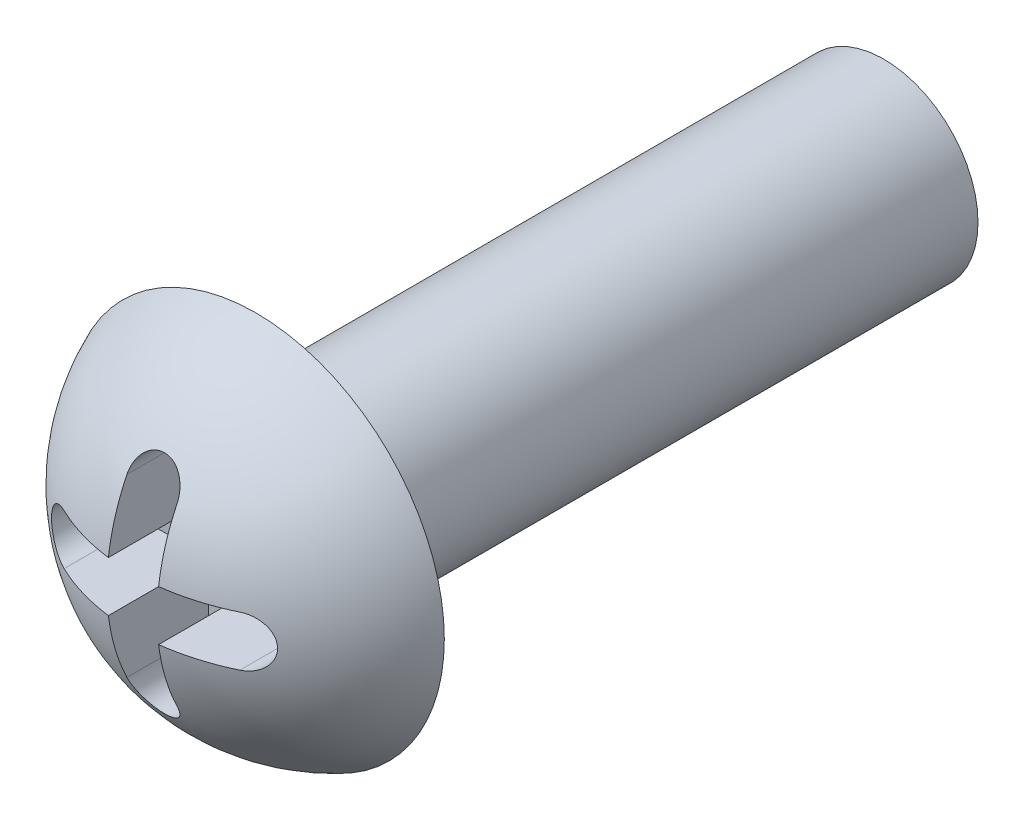
ISO-10303-21;
HEADER;
FILE_DESCRIPTION(('STEP AP214'),'2;1');
FILE_NAME('part.step','',(''),(''),'','','');
FILE_SCHEMA(('AUTOMOTIVE_DESIGN { 1 0 10303 214 1 1 1 1 }'));
ENDSEC;
DATA;
#1=APPLICATION_CONTEXT('core data for automotive mechanical design processes');
#2=APPLICATION_PROTOCOL_DEFINITION('international standard','automotive_design',2000,#1);
#3=PRODUCT_CONTEXT('',#1,'mechanical');
#4=PRODUCT('Part','Part','',(#3));
#5=PRODUCT_RELATED_PRODUCT_CATEGORY('part','',(#4));
#6=PRODUCT_DEFINITION_FORMATION('','',#4);
#7=PRODUCT_DEFINITION_CONTEXT('part definition',#1,'design');
#8=PRODUCT_DEFINITION('design','',#6,#7);
#9=PRODUCT_DEFINITION_SHAPE('','',#8);
#10=(LENGTH_UNIT() NAMED_UNIT(*) SI_UNIT(.MILLI.,.METRE.));
#11=(NAMED_UNIT(*) PLANE_ANGLE_UNIT() SI_UNIT($,.RADIAN.));
#12=(NAMED_UNIT(*) SI_UNIT($,.STERADIAN.) SOLID_ANGLE_UNIT());
#13=UNCERTAINTY_MEASURE_WITH_UNIT(LENGTH_MEASURE(1.E-05),#10,'distance_accuracy_value','');
#14=(GEOMETRIC_REPRESENTATION_CONTEXT(3) GLOBAL_UNCERTAINTY_ASSIGNED_CONTEXT((#13)) GLOBAL_UNIT_ASSIGNED_CONTEXT((#10,
#11,#12)) REPRESENTATION_CONTEXT('',''));
#15=CARTESIAN_POINT('',(0.,0.,0.));
#16=DIRECTION('',(0.,0.,1.));
#17=DIRECTION('',(1.,0.,0.));
#18=AXIS2_PLACEMENT_3D('',#15,#16,#17);
#19=CARTESIAN_POINT('',(-27.6153768,0.,29.6958848));
#20=DIRECTION('',(0.,0.,1.));
#21=DIRECTION('',(-1.,0.,0.));
#22=AXIS2_PLACEMENT_3D('',#19,#20,#21);
#23=SPHERICAL_SURFACE('',#22,1.62500000000001);
#24=CARTESIAN_POINT('',(-27.6153768,0.2,29.6958848));
#25=DIRECTION('',(0.,1.,0.));
#26=DIRECTION('',(-1.,0.,0.));
#27=AXIS2_PLACEMENT_3D('',#24,#25,#26);
#28=CIRCLE('',#27,1.61264534228702);
#29=CARTESIAN_POINT('',(-28.3153768,0.199999999999967,31.1486838225768));
#30=VERTEX_POINT('',#29);
#31=CARTESIAN_POINT('',(-27.8153768,0.2,31.2960801005805));
#32=VERTEX_POINT('',#31);
#33=EDGE_CURVE('E136',#30,#32,#28,.T.);
#34=ORIENTED_EDGE('',*,*,#33,.T.);
#35=CARTESIAN_POINT('',(-27.8153768,0.,29.6958848));
#36=DIRECTION('',(-1.,0.,0.));
#37=DIRECTION('',(0.,0.,1.));
#38=AXIS2_PLACEMENT_3D('',#35,#36,#37);
#39=CIRCLE('',#38,1.61264534228702);
#40=CARTESIAN_POINT('',(-27.8153768,0.7,31.1486838225767));
#41=VERTEX_POINT('',#40);
#42=EDGE_CURVE('E175',#32,#41,#39,.T.);
#43=ORIENTED_EDGE('',*,*,#42,.T.);
#44=CARTESIAN_POINT('',(-27.8153767,0.699800000000001,31.1487801850845));
#45=CARTESIAN_POINT('',(-27.8153926425318,0.712114662218609,31.1428485283511));
#46=CARTESIAN_POINT('',(-27.8142639633516,0.724417750383114,31.1368831575603));
#47=CARTESIAN_POINT('',(-27.8097522195165,0.748688611010362,31.1250436135103));
#48=CARTESIAN_POINT('',(-27.806363329716,0.760655433564896,31.1191697161355));
#49=CARTESIAN_POINT('',(-27.7973606277295,0.783889067953735,31.1076969539091));
#50=CARTESIAN_POINT('',(-27.7917439923433,0.795154970479538,31.1020984482172));
#51=CARTESIAN_POINT('',(-27.778369290326,0.816587812625166,31.0913885193177));
#52=CARTESIAN_POINT('',(-27.7706132779781,0.826755793529295,31.0862766351461));
#53=CARTESIAN_POINT('',(-27.7535634459189,0.84509588101439,31.077011567816));
#54=CARTESIAN_POINT('',(-27.7443729961195,0.853345237981694,31.0728219187545));
#55=CARTESIAN_POINT('',(-27.72439985314,0.868130791385543,31.065284717777));
#56=CARTESIAN_POINT('',(-27.7136182521384,0.87466815447501,31.0619365924603));
#57=CARTESIAN_POINT('',(-27.6920610441544,0.885058057308205,31.0566015514125));
#58=CARTESIAN_POINT('',(-27.6814174292111,0.889127971112714,31.0545048409988));
#59=CARTESIAN_POINT('',(-27.6594606111008,0.895414104810761,31.0512622145593));
#60=CARTESIAN_POINT('',(-27.6481479877185,0.897631905310909,31.0501154878175));
#61=CARTESIAN_POINT('',(-27.6264176010175,0.899963158034926,31.0489098871025));
#62=CARTESIAN_POINT('',(-27.6160252841277,0.900267033160122,31.0487525754142));
#63=CARTESIAN_POINT('',(-27.5953412975104,0.899262870048729,31.0492720516939));
#64=CARTESIAN_POINT('',(-27.5850496055834,0.897955195819684,31.0499486513027));
#65=CARTESIAN_POINT('',(-27.5652046500291,0.893861040700891,31.0520634730976));
#66=CARTESIAN_POINT('',(-27.5556382435269,0.891124340820223,31.0534760534797));
#67=CARTESIAN_POINT('',(-27.5371250264926,0.884320287382882,31.056979817719));
#68=CARTESIAN_POINT('',(-27.5281783054168,0.880252742191609,31.0590710993052));
#69=CARTESIAN_POINT('',(-27.5107046912532,0.870725705920803,31.0639546869098));
#70=CARTESIAN_POINT('',(-27.5022157660469,0.865211018375776,31.0667747018906));
#71=CARTESIAN_POINT('',(-27.4862835618641,0.853085804911503,31.0729521202818));
#72=CARTESIAN_POINT('',(-27.4788405881212,0.846474960329295,31.0763096799517));
#73=CARTESIAN_POINT('',(-27.4644492186524,0.831671506187274,31.0837969669014));
#74=CARTESIAN_POINT('',(-27.4576169325676,0.823387966935835,31.0879698813674));
#75=CARTESIAN_POINT('',(-27.4454288004766,0.805975400089806,31.0966983154967));
#76=CARTESIAN_POINT('',(-27.4400740942059,0.796845727038112,31.1012541269947));
#77=CARTESIAN_POINT('',(-27.4304141624481,0.776964872779153,31.1111236639975));
#78=CARTESIAN_POINT('',(-27.4262809850623,0.766144485069453,31.1164664782582));
#79=CARTESIAN_POINT('',(-27.4199494393645,0.744045930822048,31.1273141378819));
#80=CARTESIAN_POINT('',(-27.4177489464003,0.732768281274694,31.1328187984228));
#81=CARTESIAN_POINT('',(-27.4157523682811,0.714223688892898,31.1418185114114));
#82=CARTESIAN_POINT('',(-27.4153686658911,0.707012438050434,31.145305557395));
#83=CARTESIAN_POINT('',(-27.4153768999989,0.699800000000004,31.1487801850844));
#84=B_SPLINE_CURVE_WITH_KNOTS('',3,(#44,#45,#46,#47,#48,#49,#50,#51,#52,#53,#54,#55,#56,#57,#58,
#59,#60,#61,#62,#63,#64,#65,#66,#67,#68,#69,#70,#71,#72,#73,#74,#75,#76,#77,#78,#79,#80,#81,#82,
#83),.UNSPECIFIED.,.F.,.F.,(4,2,2,2,2,2,2,2,2,2,2,2,2,2,2,2,2,2,2,4),(0.,0.0409650806974917,
0.0820361490678399,0.123159433564273,0.164243367097882,0.203148468601334,0.242026988490456,
0.276592969296148,0.31112942101633,0.342167104759505,0.373197779173072,0.403213239786339,
0.433233024368789,0.464627055155396,0.496030228529066,0.530448689393814,0.564893625293371,
0.60299977091894,0.641063972804827,0.665081895194985),.UNSPECIFIED.);
#85=CARTESIAN_POINT('',(-27.4153768000428,0.700000000000034,31.1486838225826));
#86=VERTEX_POINT('',#85);
#87=EDGE_CURVE('E50',#41,#86,#84,.T.);
#88=ORIENTED_EDGE('',*,*,#87,.T.);
#89=CARTESIAN_POINT('',(-27.4153767999989,0.,29.6958848));
#90=DIRECTION('',(1.,0.,0.));
#91=DIRECTION('',(0.,0.,-1.));
#92=AXIS2_PLACEMENT_3D('',#89,#90,#91);
#93=CIRCLE('',#92,1.61264534228689);
#94=CARTESIAN_POINT('',(-27.4153768000428,0.200000000000034,31.2960801005859));
#95=VERTEX_POINT('',#94);
#96=EDGE_CURVE('E197',#86,#95,#93,.T.);
#97=ORIENTED_EDGE('',*,*,#96,.T.);
#98=CARTESIAN_POINT('',(-27.6153768,0.200000000000033,29.6958848));
#99=DIRECTION('',(0.,1.,0.));
#100=DIRECTION('',(-1.,0.,0.));
#101=AXIS2_PLACEMENT_3D('',#98,#99,#100);
#102=CIRCLE('',#101,1.61264534228702);
#103=CARTESIAN_POINT('',(-26.9153767999989,0.200000000000034,31.1486838225762));
#104=VERTEX_POINT('',#103);
#105=EDGE_CURVE('E194',#95,#104,#102,.T.);
#106=ORIENTED_EDGE('',*,*,#105,.T.);
#107=CARTESIAN_POINT('',(-26.9155768,0.199999900000008,31.1487801850845));
#108=CARTESIAN_POINT('',(-26.9032621377814,0.200015842531952,31.1428485283511));
#109=CARTESIAN_POINT('',(-26.8909590496169,0.198887163351787,31.1368831575603));
#110=CARTESIAN_POINT('',(-26.8666881889897,0.194375419516841,31.1250436135103));
#111=CARTESIAN_POINT('',(-26.8547213664352,0.190986529716319,31.1191697161355));
#112=CARTESIAN_POINT('',(-26.8314877320463,0.181983827730021,31.1076969539091));
#113=CARTESIAN_POINT('',(-26.8202218295205,0.176367192343894,31.1020984482172));
#114=CARTESIAN_POINT('',(-26.7987889873749,0.16299249032666,31.0913885193176));
#115=CARTESIAN_POINT('',(-26.7886210064707,0.155236477978836,31.0862766351461));
#116=CARTESIAN_POINT('',(-26.7702809189856,0.138186645919793,31.0770115678159));
#117=CARTESIAN_POINT('',(-26.7620315620183,0.128996196120405,31.0728219187544));
#118=CARTESIAN_POINT('',(-26.7472460086144,0.109023053141026,31.0652847177769));
#119=CARTESIAN_POINT('',(-26.7407086455249,0.0982414521394878,31.0619365924602));
#120=CARTESIAN_POINT('',(-26.7303187426916,0.0766842441555428,31.0566015514123));
#121=CARTESIAN_POINT('',(-26.726248828887,0.0660406292123068,31.0545048409986));
#122=CARTESIAN_POINT('',(-26.7199626951889,0.0440838111021101,31.0512622145591));
#123=CARTESIAN_POINT('',(-26.7177448946887,0.0327711877198093,31.0501154878173));
#124=CARTESIAN_POINT('',(-26.7154136419646,0.0110408010188264,31.0489098871022));
#125=CARTESIAN_POINT('',(-26.7151097668394,0.000648484129075412,31.0487525754139));
#126=CARTESIAN_POINT('',(-26.7161139299507,-0.0200355024882405,31.0492720516935));
#127=CARTESIAN_POINT('',(-26.7174216041797,-0.0303271944152311,31.0499486513024));
#128=CARTESIAN_POINT('',(-26.7215157592984,-0.0501721499694055,31.0520634730972));
#129=CARTESIAN_POINT('',(-26.724252459179,-0.0597385564715948,31.0534760534792));
#130=CARTESIAN_POINT('',(-26.7310565126163,-0.0782517735059256,31.0569798177185));
#131=CARTESIAN_POINT('',(-26.7351240578075,-0.0871984945817414,31.0590710993047));
#132=CARTESIAN_POINT('',(-26.7446510940782,-0.10467210874525,31.0639546869092));
#133=CARTESIAN_POINT('',(-26.7501657816232,-0.113161033951543,31.06677470189));
#134=CARTESIAN_POINT('',(-26.7622909950873,-0.129093238134362,31.0729521202812));
#135=CARTESIAN_POINT('',(-26.7689018396695,-0.136536211877271,31.0763096799511));
#136=CARTESIAN_POINT('',(-26.7837052938114,-0.150927581346032,31.0837969669007));
#137=CARTESIAN_POINT('',(-26.7919888330628,-0.15775986743085,31.0879698813668));
#138=CARTESIAN_POINT('',(-26.8094013999087,-0.169947999521873,31.096698315496));
#139=CARTESIAN_POINT('',(-26.8185310729603,-0.175302705792595,31.1012541269941));
#140=CARTESIAN_POINT('',(-26.8384119272192,-0.184962637550465,31.1111236639968));
#141=CARTESIAN_POINT('',(-26.8492323149288,-0.189095814936329,31.1164664782574));
#142=CARTESIAN_POINT('',(-26.8713308691761,-0.195427360634195,31.1273141378811));
#143=CARTESIAN_POINT('',(-26.8826085187234,-0.197627853598455,31.1328187984221));
#144=CARTESIAN_POINT('',(-26.9011531111058,-0.199624431717787,31.1418185114109));
#145=CARTESIAN_POINT('',(-26.9083643619489,-0.200008134107847,31.1453055573949));
#146=CARTESIAN_POINT('',(-26.9155768,-0.199999900000023,31.1487801850845));
#147=B_SPLINE_CURVE_WITH_KNOTS('',3,(#107,#108,#109,#110,#111,#112,#113,#114,#115,#116,#117,
#118,#119,#120,#121,#122,#123,#124,#125,#126,#127,#128,#129,#130,#131,#132,#133,#134,#135,#136,
#137,#138,#139,#140,#141,#142,#143,#144,#145,#146),.UNSPECIFIED.,.F.,.F.,(4,2,2,2,2,2,2,2,2,2,2,
2,2,2,2,2,2,2,2,4),(0.,0.0409650806974295,0.0820361490677104,0.123159433564081,
0.164243367097622,0.203148468601035,0.242026988490105,0.276592969295751,0.311129421015887,
0.342167104758999,0.373197779172499,0.403213239785672,0.433233024368028,0.464627055154519,
0.49603022852808,0.530448689392699,0.564893625292131,0.602999770917566,0.641063972803339,
0.665081895195618),.UNSPECIFIED.);
#148=CARTESIAN_POINT('',(-26.915376799999,-0.199999999999984,31.1486838225763));
#149=VERTEX_POINT('',#148);
#150=EDGE_CURVE('E191',#104,#149,#147,.T.);
#151=ORIENTED_EDGE('',*,*,#150,.T.);
#152=CARTESIAN_POINT('',(-27.6153768,-0.2,29.6958848));
#153=DIRECTION('',(0.,-1.,0.));
#154=DIRECTION('',(1.,0.,0.));
#155=AXIS2_PLACEMENT_3D('',#152,#153,#154);
#156=CIRCLE('',#155,1.61264534228702);
#157=CARTESIAN_POINT('',(-27.4153768000428,-0.2,31.2960801005859));
#158=VERTEX_POINT('',#157);
#159=EDGE_CURVE('E188',#149,#158,#156,.T.);
#160=ORIENTED_EDGE('',*,*,#159,.T.);
#161=CARTESIAN_POINT('',(-27.4153768000428,0.,29.6958848));
#162=DIRECTION('',(1.,0.,0.));
#163=DIRECTION('',(0.,1.,0.));
#164=AXIS2_PLACEMENT_3D('',#161,#162,#163);
#165=CIRCLE('',#164,1.61264534229233);
#166=CARTESIAN_POINT('',(-27.4153768000428,-0.700000000000002,31.1486838225826));
#167=VERTEX_POINT('',#166);
#168=EDGE_CURVE('E185',#158,#167,#165,.T.);
#169=ORIENTED_EDGE('',*,*,#168,.T.);
#170=CARTESIAN_POINT('',(-27.4153769000428,-0.699800000000001,31.1487801850904));
#171=CARTESIAN_POINT('',(-27.415360957511,-0.712114662218661,31.142848528357));
#172=CARTESIAN_POINT('',(-27.4164896366912,-0.724417750383203,31.1368831575661));
#173=CARTESIAN_POINT('',(-27.4210013805263,-0.748688611010488,31.125043613516));
#174=CARTESIAN_POINT('',(-27.4243902703269,-0.760655433565023,31.1191697161412));
#175=CARTESIAN_POINT('',(-27.4333929723134,-0.78388906795383,31.1076969539146));
#176=CARTESIAN_POINT('',(-27.4390096076996,-0.795154970479601,31.1020984482225));
#177=CARTESIAN_POINT('',(-27.452384309717,-0.816587812625151,31.0913885193227));
#178=CARTESIAN_POINT('',(-27.4601403220649,-0.826755793529233,31.086276635151));
#179=CARTESIAN_POINT('',(-27.4771901541241,-0.84509588101432,31.0770115678203));
#180=CARTESIAN_POINT('',(-27.4863806039236,-0.85334523798165,31.0728219187586));
#181=CARTESIAN_POINT('',(-27.5063537469033,-0.868130791385518,31.0652847177805));
#182=CARTESIAN_POINT('',(-27.5171353479049,-0.874668154474979,31.0619365924635));
#183=CARTESIAN_POINT('',(-27.5386925558892,-0.885058057308153,31.056601551415));
#184=CARTESIAN_POINT('',(-27.5493361708326,-0.889127971112644,31.054504841001));
#185=CARTESIAN_POINT('',(-27.5712929889432,-0.895414104810603,31.0512622145609));
#186=CARTESIAN_POINT('',(-27.5826056123258,-0.89763190531068,31.0501154878188));
#187=CARTESIAN_POINT('',(-27.6043359990271,-0.899963158034493,31.0489098871031));
#188=CARTESIAN_POINT('',(-27.6147283159169,-0.900267033159572,31.0487525754146));
#189=CARTESIAN_POINT('',(-27.6354123025345,-0.899262870047911,31.0492720516938));
#190=CARTESIAN_POINT('',(-27.6457039944616,-0.897955195818714,31.0499486513024));
#191=CARTESIAN_POINT('',(-27.6655489500158,-0.893861040699612,31.0520634730967));
#192=CARTESIAN_POINT('',(-27.675115356518,-0.891124340818807,31.0534760534786));
#193=CARTESIAN_POINT('',(-27.6936285735522,-0.884320287381194,31.0569798177175));
#194=CARTESIAN_POINT('',(-27.702575294628,-0.880252742189785,31.0590710993035));
#195=CARTESIAN_POINT('',(-27.7200489087913,-0.870725705918757,31.0639546869076));
#196=CARTESIAN_POINT('',(-27.7285378339974,-0.865211018373655,31.0667747018882));
#197=CARTESIAN_POINT('',(-27.74447003818,-0.853085804909263,31.0729521202791));
#198=CARTESIAN_POINT('',(-27.7519130119227,-0.846474960327011,31.0763096799487));
#199=CARTESIAN_POINT('',(-27.7663043813911,-0.831671506184967,31.083796966898));
#200=CARTESIAN_POINT('',(-27.7731366674757,-0.823387966933556,31.0879698813639));
#201=CARTESIAN_POINT('',(-27.7853247995663,-0.805975400087629,31.0966983154927));
#202=CARTESIAN_POINT('',(-27.7906795058369,-0.796845727036009,31.1012541269906));
#203=CARTESIAN_POINT('',(-27.8003394375943,-0.776964872777235,31.111123663993));
#204=CARTESIAN_POINT('',(-27.80447261498,-0.766144485067649,31.1164664782535));
#205=CARTESIAN_POINT('',(-27.8108041606775,-0.744045930820519,31.1273141378769));
#206=CARTESIAN_POINT('',(-27.8130046536416,-0.732768281273325,31.1328187984178));
#207=CARTESIAN_POINT('',(-27.8150012317607,-0.714223688892095,31.141818511406));
#208=CARTESIAN_POINT('',(-27.8153849341507,-0.707012438050028,31.1453055573895));
#209=CARTESIAN_POINT('',(-27.8153767000429,-0.699800000000001,31.1487801850786));
#210=B_SPLINE_CURVE_WITH_KNOTS('',3,(#170,#171,#172,#173,#174,#175,#176,#177,#178,#179,#180,
#181,#182,#183,#184,#185,#186,#187,#188,#189,#190,#191,#192,#193,#194,#195,#196,#197,#198,#199,
#200,#201,#202,#203,#204,#205,#206,#207,#208,#209),.UNSPECIFIED.,.F.,.F.,(4,2,2,2,2,2,2,2,2,2,2,
2,2,2,2,2,2,2,2,4),(0.,0.0409650806976314,0.0820361490680916,0.123159433564626,
0.164243367098351,0.20314846860229,0.242026988491879,0.276592969298154,0.311129421018915,
0.342167104762373,0.373197779176219,0.403213239789364,0.433233024371692,0.464627055157856,
0.496030228531086,0.530448689395195,0.564893625294118,0.602999770919046,0.641063972804294,
0.665081895193132),.UNSPECIFIED.);
#211=CARTESIAN_POINT('',(-27.8153768,-0.7,31.1486838225767));
#212=VERTEX_POINT('',#211);
#213=EDGE_CURVE('E182',#167,#212,#210,.T.);
#214=ORIENTED_EDGE('',*,*,#213,.T.);
#215=CARTESIAN_POINT('',(-27.8153768,0.,29.6958848));
#216=DIRECTION('',(-1.,0.,0.));
#217=DIRECTION('',(0.,0.,1.));
#218=AXIS2_PLACEMENT_3D('',#215,#216,#217);
#219=CIRCLE('',#218,1.61264534228702);
#220=CARTESIAN_POINT('',(-27.8153768,-0.2,31.2960801005805));
#221=VERTEX_POINT('',#220);
#222=EDGE_CURVE('E179',#212,#221,#219,.T.);
#223=ORIENTED_EDGE('',*,*,#222,.T.);
#224=CARTESIAN_POINT('',(-27.6153768,-0.2,29.6958848));
#225=DIRECTION('',(0.,-1.,0.));
#226=DIRECTION('',(1.,0.,0.));
#227=AXIS2_PLACEMENT_3D('',#224,#225,#226);
#228=CIRCLE('',#227,1.61264534228702);
#229=CARTESIAN_POINT('',(-28.3153768,-0.2,31.1486838225767));
#230=VERTEX_POINT('',#229);
#231=EDGE_CURVE('E133',#221,#230,#228,.T.);
#232=ORIENTED_EDGE('',*,*,#231,.T.);
#233=CARTESIAN_POINT('',(-28.3151768,-0.199999899999975,31.1487801850845));
#234=CARTESIAN_POINT('',(-28.3274914622186,-0.200015842531854,31.1428485283511));
#235=CARTESIAN_POINT('',(-28.339794550383,-0.198887163351626,31.1368831575603));
#236=CARTESIAN_POINT('',(-28.3640654110102,-0.194375419516559,31.1250436135103));
#237=CARTESIAN_POINT('',(-28.3760322335647,-0.190986529715978,31.1191697161356));
#238=CARTESIAN_POINT('',(-28.3992658679535,-0.181983827729567,31.1076969539092));
#239=CARTESIAN_POINT('',(-28.4105317704793,-0.176367192343388,31.1020984482173));
#240=CARTESIAN_POINT('',(-28.4319646126248,-0.162992490326055,31.0913885193179));
#241=CARTESIAN_POINT('',(-28.4421325935289,-0.155236477978184,31.0862766351463));
#242=CARTESIAN_POINT('',(-28.460472681014,-0.138186645919063,31.0770115678162));
#243=CARTESIAN_POINT('',(-28.4687220379813,-0.128996196119644,31.0728219187548));
#244=CARTESIAN_POINT('',(-28.4835075913851,-0.109023053140218,31.0652847177773));
#245=CARTESIAN_POINT('',(-28.4900449544745,-0.0982414521386637,31.0619365924606));
#246=CARTESIAN_POINT('',(-28.5004348573077,-0.0766842441546998,31.0566015514129));
#247=CARTESIAN_POINT('',(-28.5045047711122,-0.0660406292114596,31.0545048409991));
#248=CARTESIAN_POINT('',(-28.5107909048102,-0.0440838111012666,31.0512622145597));
#249=CARTESIAN_POINT('',(-28.5130087053103,-0.0327711877189738,31.0501154878179));
#250=CARTESIAN_POINT('',(-28.5153399580344,-0.0110408010180056,31.0489098871028));
#251=CARTESIAN_POINT('',(-28.5156438331595,-0.00064848412826003,31.0487525754146));
#252=CARTESIAN_POINT('',(-28.5146396700482,0.0200355024890375,31.0492720516943));
#253=CARTESIAN_POINT('',(-28.5133319958191,0.0303271944160151,31.0499486513031));
#254=CARTESIAN_POINT('',(-28.5092378407003,0.0501721499701689,31.052063473098));
#255=CARTESIAN_POINT('',(-28.5065011408197,0.0597385564723502,31.05347605348));
#256=CARTESIAN_POINT('',(-28.4996970873824,0.0782517735066604,31.0569798177194));
#257=CARTESIAN_POINT('',(-28.4956295421911,0.0871984945824637,31.0590710993056));
#258=CARTESIAN_POINT('',(-28.4861025059203,0.104672108745947,31.0639546869101));
#259=CARTESIAN_POINT('',(-28.4805878183753,0.113161033952227,31.0667747018909));
#260=CARTESIAN_POINT('',(-28.4684626049111,0.129093238135011,31.0729521202822));
#261=CARTESIAN_POINT('',(-28.4618517603289,0.1365362118779,31.076309679952));
#262=CARTESIAN_POINT('',(-28.4470483061869,0.150927581346614,31.0837969669017));
#263=CARTESIAN_POINT('',(-28.4387647669355,0.157759867431406,31.0879698813677));
#264=CARTESIAN_POINT('',(-28.4213522000895,0.169947999522367,31.096698315497));
#265=CARTESIAN_POINT('',(-28.4122225270378,0.175302705793056,31.101254126995));
#266=CARTESIAN_POINT('',(-28.3923416727789,0.184962637550848,31.1111236639978));
#267=CARTESIAN_POINT('',(-28.3815212850692,0.189095814936667,31.1164664782584));
#268=CARTESIAN_POINT('',(-28.3594227308219,0.195427360634436,31.1273141378821));
#269=CARTESIAN_POINT('',(-28.3481450812745,0.197627853598644,31.132818798423));
#270=CARTESIAN_POINT('',(-28.3296004888928,0.199624431717817,31.1418185114116));
#271=CARTESIAN_POINT('',(-28.3223892380504,0.200008134107843,31.1453055573952));
#272=CARTESIAN_POINT('',(-28.3151768,0.199999900000058,31.1487801850845));
#273=B_SPLINE_CURVE_WITH_KNOTS('',3,(#233,#234,#235,#236,#237,#238,#239,#240,#241,#242,#243,
#244,#245,#246,#247,#248,#249,#250,#251,#252,#253,#254,#255,#256,#257,#258,#259,#260,#261,#262,
#263,#264,#265,#266,#267,#268,#269,#270,#271,#272),.UNSPECIFIED.,.F.,.F.,(4,2,2,2,2,2,2,2,2,2,2,
2,2,2,2,2,2,2,2,4),(0.,0.0409650806973742,0.0820361490676116,0.12315943356393,0.164243367097426,
0.203148468600773,0.242026988489771,0.276592969295357,0.311129421015435,0.342167104758526,
0.373197779172006,0.403213239785194,0.433233024367568,0.464627055154097,0.496030228527692,
0.530448689392356,0.564893625291826,0.6029997709173,0.641063972803094,0.665081895193127),.UNSPECIFIED.);
#274=EDGE_CURVE('E128',#230,#30,#273,.T.);
#275=ORIENTED_EDGE('',*,*,#274,.T.);
#276=EDGE_LOOP('',(#34,#43,#88,#97,#106,#151,#160,#169,#214,#223,#232,#275));
#277=FACE_BOUND('',#276,.T.);
#278=CARTESIAN_POINT('',(-27.6153768,0.,30.3208848));
#279=DIRECTION('',(0.,0.,1.));
#280=DIRECTION('',(1.,0.,0.));
#281=AXIS2_PLACEMENT_3D('',#278,#279,#280);
#282=CIRCLE('',#281,1.5);
#283=CARTESIAN_POINT('',(-26.1153768,0.,30.3208848));
#284=VERTEX_POINT('',#283);
#285=EDGE_CURVE('E43',#284,#284,#282,.T.);
#286=ORIENTED_EDGE('',*,*,#285,.T.);
#287=EDGE_LOOP('',(#286));
#288=FACE_BOUND('',#287,.T.);
#289=ADVANCED_FACE('F36',(#277,#288),#23,.T.);
#290=CARTESIAN_POINT('',(-26.1153768,0.,30.3208848));
#291=DIRECTION('',(0.,0.,-1.));
#292=DIRECTION('',(-1.,0.,0.));
#293=AXIS2_PLACEMENT_3D('',#290,#291,#292);
#294=PLANE('',#293);
#295=CARTESIAN_POINT('',(-27.6153768,0.,30.3208848));
#296=DIRECTION('',(0.,0.,-1.));
#297=DIRECTION('',(-1.,0.,0.));
#298=AXIS2_PLACEMENT_3D('',#295,#296,#297);
#299=CIRCLE('',#298,0.750000000000001);
#300=CARTESIAN_POINT('',(-28.3653768,0.,30.3208848));
#301=VERTEX_POINT('',#300);
#302=EDGE_CURVE('E11',#301,#301,#299,.T.);
#303=ORIENTED_EDGE('',*,*,#302,.F.);
#304=EDGE_LOOP('',(#303));
#305=FACE_BOUND('',#304,.T.);
#306=ORIENTED_EDGE('',*,*,#285,.F.);
#307=EDGE_LOOP('',(#306));
#308=FACE_BOUND('',#307,.T.);
#309=ADVANCED_FACE('F269',(#305,#308),#294,.T.);
#310=CARTESIAN_POINT('',(-28.3153768,0.2,31.3218848));
#311=DIRECTION('',(0.,1.,0.));
#312=DIRECTION('',(-1.,0.,0.));
#313=AXIS2_PLACEMENT_3D('',#310,#311,#312);
#314=PLANE('',#313);
#315=ORIENTED_EDGE('',*,*,#33,.F.);
#316=DIRECTION('',(0.,0.,-1.));
#317=VECTOR('',#316,1.);
#318=CARTESIAN_POINT('',(-28.3153768,0.199999999999967,31.3218848));
#319=LINE('',#318,#317);
#320=CARTESIAN_POINT('',(-28.3153768,0.199999999999967,30.5));
#321=VERTEX_POINT('',#320);
#322=EDGE_CURVE('E125',#30,#321,#319,.T.);
#323=ORIENTED_EDGE('',*,*,#322,.T.);
#324=DIRECTION('',(1.,0.,0.));
#325=VECTOR('',#324,1.);
#326=CARTESIAN_POINT('',(-28.3153768,0.2,30.5));
#327=LINE('',#326,#325);
#328=CARTESIAN_POINT('',(-27.8153768,0.2,30.5));
#329=VERTEX_POINT('',#328);
#330=EDGE_CURVE('E201',#321,#329,#327,.T.);
#331=ORIENTED_EDGE('',*,*,#330,.T.);
#332=DIRECTION('',(0.,0.,-1.));
#333=VECTOR('',#332,1.);
#334=CARTESIAN_POINT('',(-27.8153768,0.2,31.3218848));
#335=LINE('',#334,#333);
#336=EDGE_CURVE('E58',#32,#329,#335,.T.);
#337=ORIENTED_EDGE('',*,*,#336,.F.);
#338=EDGE_LOOP('',(#315,#323,#331,#337));
#339=FACE_BOUND('',#338,.T.);
#340=ADVANCED_FACE('F137',(#339),#314,.F.);
#341=CARTESIAN_POINT('',(-28.3153768,0.,31.3218848));
#342=DIRECTION('',(0.,0.,-1.));
#343=DIRECTION('',(-1.,0.,0.));
#344=AXIS2_PLACEMENT_3D('',#341,#342,#343);
#345=CYLINDRICAL_SURFACE('',#344,0.2);
#346=ORIENTED_EDGE('',*,*,#274,.F.);
#347=DIRECTION('',(0.,0.,-1.));
#348=VECTOR('',#347,1.);
#349=CARTESIAN_POINT('',(-28.3153768,-0.2,31.3218848));
#350=LINE('',#349,#348);
#351=CARTESIAN_POINT('',(-28.3153768,-0.2,30.5));
#352=VERTEX_POINT('',#351);
#353=EDGE_CURVE('E177',#230,#352,#350,.T.);
#354=ORIENTED_EDGE('',*,*,#353,.T.);
#355=CARTESIAN_POINT('',(-28.3153768,0.,30.5));
#356=DIRECTION('',(0.,0.,-1.));
#357=DIRECTION('',(-1.,0.,0.));
#358=AXIS2_PLACEMENT_3D('',#355,#356,#357);
#359=CIRCLE('',#358,0.2);
#360=EDGE_CURVE('E131',#352,#321,#359,.T.);
#361=ORIENTED_EDGE('',*,*,#360,.T.);
#362=ORIENTED_EDGE('',*,*,#322,.F.);
#363=EDGE_LOOP('',(#346,#354,#361,#362));
#364=FACE_BOUND('',#363,.T.);
#365=ADVANCED_FACE('F126',(#364),#345,.F.);
#366=CARTESIAN_POINT('',(-27.8153768,-0.2,31.3218848));
#367=DIRECTION('',(0.,-1.,0.));
#368=DIRECTION('',(1.,0.,0.));
#369=AXIS2_PLACEMENT_3D('',#366,#367,#368);
#370=PLANE('',#369);
#371=ORIENTED_EDGE('',*,*,#231,.F.);
#372=DIRECTION('',(0.,0.,-1.));
#373=VECTOR('',#372,1.);
#374=CARTESIAN_POINT('',(-27.8153768,-0.2,31.3218848));
#375=LINE('',#374,#373);
#376=CARTESIAN_POINT('',(-27.8153768,-0.2,30.5));
#377=VERTEX_POINT('',#376);
#378=EDGE_CURVE('E180',#221,#377,#375,.T.);
#379=ORIENTED_EDGE('',*,*,#378,.T.);
#380=DIRECTION('',(-1.,0.,0.));
#381=VECTOR('',#380,1.);
#382=CARTESIAN_POINT('',(-27.8153768,-0.2,30.5));
#383=LINE('',#382,#381);
#384=EDGE_CURVE('E204',#377,#352,#383,.T.);
#385=ORIENTED_EDGE('',*,*,#384,.T.);
#386=ORIENTED_EDGE('',*,*,#353,.F.);
#387=EDGE_LOOP('',(#371,#379,#385,#386));
#388=FACE_BOUND('',#387,.T.);
#389=ADVANCED_FACE('F283',(#388),#370,.F.);
#390=CARTESIAN_POINT('',(-27.8153768,-0.7,31.3218848));
#391=DIRECTION('',(-1.,0.,0.));
#392=DIRECTION('',(0.,0.,1.));
#393=AXIS2_PLACEMENT_3D('',#390,#391,#392);
#394=PLANE('',#393);
#395=ORIENTED_EDGE('',*,*,#222,.F.);
#396=DIRECTION('',(0.,0.,-1.));
#397=VECTOR('',#396,1.);
#398=CARTESIAN_POINT('',(-27.8153768,-0.7,31.3218848));
#399=LINE('',#398,#397);
#400=CARTESIAN_POINT('',(-27.8153768,-0.7,30.5));
#401=VERTEX_POINT('',#400);
#402=EDGE_CURVE('E183',#212,#401,#399,.T.);
#403=ORIENTED_EDGE('',*,*,#402,.T.);
#404=DIRECTION('',(0.,1.,0.));
#405=VECTOR('',#404,1.);
#406=CARTESIAN_POINT('',(-27.8153768,-0.7,30.5));
#407=LINE('',#406,#405);
#408=EDGE_CURVE('E207',#401,#377,#407,.T.);
#409=ORIENTED_EDGE('',*,*,#408,.T.);
#410=ORIENTED_EDGE('',*,*,#378,.F.);
#411=EDGE_LOOP('',(#395,#403,#409,#410));
#412=FACE_BOUND('',#411,.T.);
#413=ADVANCED_FACE('F286',(#412),#394,.F.);
#414=CARTESIAN_POINT('',(-27.6153768000214,-0.700000000000032,31.3218848));
#415=DIRECTION('',(0.,0.,-1.));
#416=DIRECTION('',(-1.,0.,0.));
#417=AXIS2_PLACEMENT_3D('',#414,#415,#416);
#418=CYLINDRICAL_SURFACE('',#417,0.199999999978591);
#419=ORIENTED_EDGE('',*,*,#213,.F.);
#420=DIRECTION('',(0.,0.,-1.));
#421=VECTOR('',#420,1.);
#422=CARTESIAN_POINT('',(-27.4153768000428,-0.700000000000002,31.3218848));
#423=LINE('',#422,#421);
#424=CARTESIAN_POINT('',(-27.4153768000428,-0.700000000000002,30.5));
#425=VERTEX_POINT('',#424);
#426=EDGE_CURVE('E186',#167,#425,#423,.T.);
#427=ORIENTED_EDGE('',*,*,#426,.T.);
#428=CARTESIAN_POINT('',(-27.6153768000214,-0.700000000000032,30.5));
#429=DIRECTION('',(0.,0.,-1.));
#430=DIRECTION('',(-1.,0.,0.));
#431=AXIS2_PLACEMENT_3D('',#428,#429,#430);
#432=CIRCLE('',#431,0.199999999978591);
#433=EDGE_CURVE('E213',#425,#401,#432,.T.);
#434=ORIENTED_EDGE('',*,*,#433,.T.);
#435=ORIENTED_EDGE('',*,*,#402,.F.);
#436=EDGE_LOOP('',(#419,#427,#434,#435));
#437=FACE_BOUND('',#436,.T.);
#438=ADVANCED_FACE('F290',(#437),#418,.F.);
#439=CARTESIAN_POINT('',(-27.4153768000428,-0.2,31.3218848));
#440=DIRECTION('',(1.,0.,0.));
#441=DIRECTION('',(0.,1.,0.));
#442=AXIS2_PLACEMENT_3D('',#439,#440,#441);
#443=PLANE('',#442);
#444=ORIENTED_EDGE('',*,*,#168,.F.);
#445=DIRECTION('',(0.,0.,-1.));
#446=VECTOR('',#445,1.);
#447=CARTESIAN_POINT('',(-27.4153768000428,-0.2,31.3218848));
#448=LINE('',#447,#446);
#449=CARTESIAN_POINT('',(-27.4153768000428,-0.2,30.5));
#450=VERTEX_POINT('',#449);
#451=EDGE_CURVE('E189',#158,#450,#448,.T.);
#452=ORIENTED_EDGE('',*,*,#451,.T.);
#453=DIRECTION('',(0.,-1.,0.));
#454=VECTOR('',#453,1.);
#455=CARTESIAN_POINT('',(-27.4153768000428,-0.2,30.5));
#456=LINE('',#455,#454);
#457=EDGE_CURVE('E216',#450,#425,#456,.T.);
#458=ORIENTED_EDGE('',*,*,#457,.T.);
#459=ORIENTED_EDGE('',*,*,#426,.F.);
#460=EDGE_LOOP('',(#444,#452,#458,#459));
#461=FACE_BOUND('',#460,.T.);
#462=ADVANCED_FACE('F294',(#461),#443,.F.);
#463=CARTESIAN_POINT('',(-26.915376799999,-0.2,31.3218848));
#464=DIRECTION('',(0.,-1.,0.));
#465=DIRECTION('',(1.,0.,0.));
#466=AXIS2_PLACEMENT_3D('',#463,#464,#465);
#467=PLANE('',#466);
#468=ORIENTED_EDGE('',*,*,#159,.F.);
#469=DIRECTION('',(0.,0.,-1.));
#470=VECTOR('',#469,1.);
#471=CARTESIAN_POINT('',(-26.915376799999,-0.199999999999984,31.3218848));
#472=LINE('',#471,#470);
#473=CARTESIAN_POINT('',(-26.915376799999,-0.199999999999984,30.5));
#474=VERTEX_POINT('',#473);
#475=EDGE_CURVE('E192',#149,#474,#472,.T.);
#476=ORIENTED_EDGE('',*,*,#475,.T.);
#477=DIRECTION('',(-1.,0.,0.));
#478=VECTOR('',#477,1.);
#479=CARTESIAN_POINT('',(-26.915376799999,-0.2,30.5));
#480=LINE('',#479,#478);
#481=EDGE_CURVE('E219',#474,#450,#480,.T.);
#482=ORIENTED_EDGE('',*,*,#481,.T.);
#483=ORIENTED_EDGE('',*,*,#451,.F.);
#484=EDGE_LOOP('',(#468,#476,#482,#483));
#485=FACE_BOUND('',#484,.T.);
#486=ADVANCED_FACE('F298',(#485),#467,.F.);
#487=CARTESIAN_POINT('',(-26.915376799999,0.,31.3218848));
#488=DIRECTION('',(0.,0.,-1.));
#489=DIRECTION('',(-1.,0.,0.));
#490=AXIS2_PLACEMENT_3D('',#487,#488,#489);
#491=CYLINDRICAL_SURFACE('',#490,0.200000000000017);
#492=ORIENTED_EDGE('',*,*,#150,.F.);
#493=DIRECTION('',(0.,0.,-1.));
#494=VECTOR('',#493,1.);
#495=CARTESIAN_POINT('',(-26.9153767999989,0.200000000000034,31.3218848));
#496=LINE('',#495,#494);
#497=CARTESIAN_POINT('',(-26.9153767999989,0.200000000000034,30.5));
#498=VERTEX_POINT('',#497);
#499=EDGE_CURVE('E195',#104,#498,#496,.T.);
#500=ORIENTED_EDGE('',*,*,#499,.T.);
#501=CARTESIAN_POINT('',(-26.915376799999,0.,30.5));
#502=DIRECTION('',(0.,0.,-1.));
#503=DIRECTION('',(-1.,0.,0.));
#504=AXIS2_PLACEMENT_3D('',#501,#502,#503);
#505=CIRCLE('',#504,0.200000000000017);
#506=EDGE_CURVE('E222',#498,#474,#505,.T.);
#507=ORIENTED_EDGE('',*,*,#506,.T.);
#508=ORIENTED_EDGE('',*,*,#475,.F.);
#509=EDGE_LOOP('',(#492,#500,#507,#508));
#510=FACE_BOUND('',#509,.T.);
#511=ADVANCED_FACE('F302',(#510),#491,.F.);
#512=CARTESIAN_POINT('',(-27.4153768000428,0.200000000000034,31.3218848));
#513=DIRECTION('',(0.,1.,0.));
#514=DIRECTION('',(-1.,0.,0.));
#515=AXIS2_PLACEMENT_3D('',#512,#513,#514);
#516=PLANE('',#515);
#517=ORIENTED_EDGE('',*,*,#105,.F.);
#518=DIRECTION('',(0.,0.,-1.));
#519=VECTOR('',#518,1.);
#520=CARTESIAN_POINT('',(-27.4153768000428,0.200000000000034,31.3218848));
#521=LINE('',#520,#519);
#522=CARTESIAN_POINT('',(-27.4153768000428,0.200000000000034,30.5));
#523=VERTEX_POINT('',#522);
#524=EDGE_CURVE('E174',#95,#523,#521,.T.);
#525=ORIENTED_EDGE('',*,*,#524,.T.);
#526=DIRECTION('',(1.,0.,0.));
#527=VECTOR('',#526,1.);
#528=CARTESIAN_POINT('',(-27.4153768000428,0.200000000000034,30.5));
#529=LINE('',#528,#527);
#530=EDGE_CURVE('E225',#523,#498,#529,.T.);
#531=ORIENTED_EDGE('',*,*,#530,.T.);
#532=ORIENTED_EDGE('',*,*,#499,.F.);
#533=EDGE_LOOP('',(#517,#525,#531,#532));
#534=FACE_BOUND('',#533,.T.);
#535=ADVANCED_FACE('F306',(#534),#516,.F.);
#536=CARTESIAN_POINT('',(-27.4153768000428,0.700000000000034,31.3218848));
#537=DIRECTION('',(1.,0.,0.));
#538=DIRECTION('',(0.,0.,-1.));
#539=AXIS2_PLACEMENT_3D('',#536,#537,#538);
#540=PLANE('',#539);
#541=ORIENTED_EDGE('',*,*,#96,.F.);
#542=DIRECTION('',(0.,0.,-1.));
#543=VECTOR('',#542,1.);
#544=CARTESIAN_POINT('',(-27.4153768000428,0.700000000000034,31.3218848));
#545=LINE('',#544,#543);
#546=CARTESIAN_POINT('',(-27.4153768000428,0.700000000000034,30.5));
#547=VERTEX_POINT('',#546);
#548=EDGE_CURVE('E173',#86,#547,#545,.T.);
#549=ORIENTED_EDGE('',*,*,#548,.T.);
#550=DIRECTION('',(0.,-1.,0.));
#551=VECTOR('',#550,1.);
#552=CARTESIAN_POINT('',(-27.4153768000428,0.700000000000034,30.5));
#553=LINE('',#552,#551);
#554=EDGE_CURVE('E228',#547,#523,#553,.T.);
#555=ORIENTED_EDGE('',*,*,#554,.T.);
#556=ORIENTED_EDGE('',*,*,#524,.F.);
#557=EDGE_LOOP('',(#541,#549,#555,#556));
#558=FACE_BOUND('',#557,.T.);
#559=ADVANCED_FACE('F310',(#558),#540,.F.);
#560=CARTESIAN_POINT('',(-27.6153768000214,0.700000000000034,31.3218848));
#561=DIRECTION('',(0.,0.,-1.));
#562=DIRECTION('',(-1.,0.,0.));
#563=AXIS2_PLACEMENT_3D('',#560,#561,#562);
#564=CYLINDRICAL_SURFACE('',#563,0.199999999978589);
#565=ORIENTED_EDGE('',*,*,#87,.F.);
#566=DIRECTION('',(0.,0.,-1.));
#567=VECTOR('',#566,1.);
#568=CARTESIAN_POINT('',(-27.8153768,0.7,31.3218848));
#569=LINE('',#568,#567);
#570=CARTESIAN_POINT('',(-27.8153768,0.7,30.5));
#571=VERTEX_POINT('',#570);
#572=EDGE_CURVE('E200',#41,#571,#569,.T.);
#573=ORIENTED_EDGE('',*,*,#572,.T.);
#574=CARTESIAN_POINT('',(-27.6153768000214,0.700000000000034,30.5));
#575=DIRECTION('',(0.,0.,-1.));
#576=DIRECTION('',(-1.,0.,0.));
#577=AXIS2_PLACEMENT_3D('',#574,#575,#576);
#578=CIRCLE('',#577,0.199999999978589);
#579=EDGE_CURVE('E231',#571,#547,#578,.T.);
#580=ORIENTED_EDGE('',*,*,#579,.T.);
#581=ORIENTED_EDGE('',*,*,#548,.F.);
#582=EDGE_LOOP('',(#565,#573,#580,#581));
#583=FACE_BOUND('',#582,.T.);
#584=ADVANCED_FACE('F314',(#583),#564,.F.);
#585=CARTESIAN_POINT('',(-27.8153768,0.2,31.3218848));
#586=DIRECTION('',(-1.,0.,0.));
#587=DIRECTION('',(0.,0.,1.));
#588=AXIS2_PLACEMENT_3D('',#585,#586,#587);
#589=PLANE('',#588);
#590=ORIENTED_EDGE('',*,*,#42,.F.);
#591=ORIENTED_EDGE('',*,*,#336,.T.);
#592=DIRECTION('',(0.,1.,0.));
#593=VECTOR('',#592,1.);
#594=CARTESIAN_POINT('',(-27.8153768,0.2,30.5));
#595=LINE('',#594,#593);
#596=EDGE_CURVE('E234',#329,#571,#595,.T.);
#597=ORIENTED_EDGE('',*,*,#596,.T.);
#598=ORIENTED_EDGE('',*,*,#572,.F.);
#599=EDGE_LOOP('',(#590,#591,#597,#598));
#600=FACE_BOUND('',#599,.T.);
#601=ADVANCED_FACE('F257',(#600),#589,.F.);
#602=CARTESIAN_POINT('',(-27.6153768000214,0.700000000000034,30.5));
#603=DIRECTION('',(0.,0.,-1.));
#604=DIRECTION('',(-1.,0.,0.));
#605=AXIS2_PLACEMENT_3D('',#602,#603,#604);
#606=PLANE('',#605);
#607=ORIENTED_EDGE('',*,*,#330,.F.);
#608=ORIENTED_EDGE('',*,*,#360,.F.);
#609=ORIENTED_EDGE('',*,*,#384,.F.);
#610=ORIENTED_EDGE('',*,*,#408,.F.);
#611=ORIENTED_EDGE('',*,*,#433,.F.);
#612=ORIENTED_EDGE('',*,*,#457,.F.);
#613=ORIENTED_EDGE('',*,*,#481,.F.);
#614=ORIENTED_EDGE('',*,*,#506,.F.);
#615=ORIENTED_EDGE('',*,*,#530,.F.);
#616=ORIENTED_EDGE('',*,*,#554,.F.);
#617=ORIENTED_EDGE('',*,*,#579,.F.);
#618=ORIENTED_EDGE('',*,*,#596,.F.);
#619=EDGE_LOOP('',(#607,#608,#609,#610,#611,#612,#613,#614,#615,#616,#617,#618));
#620=FACE_BOUND('',#619,.T.);
#621=ADVANCED_FACE('F253',(#620),#606,.F.);
#622=CARTESIAN_POINT('',(-27.6153768,0.,25.3208848));
#623=DIRECTION('',(0.,0.,1.));
#624=DIRECTION('',(1.,0.,0.));
#625=AXIS2_PLACEMENT_3D('',#622,#623,#624);
#626=CYLINDRICAL_SURFACE('',#625,0.750000000000001);
#627=CARTESIAN_POINT('',(-27.6153768,0.,25.3208848));
#628=DIRECTION('',(0.,0.,1.));
#629=DIRECTION('',(1.,0.,0.));
#630=AXIS2_PLACEMENT_3D('',#627,#628,#629);
#631=CIRCLE('',#630,0.750000000000001);
#632=CARTESIAN_POINT('',(-26.8653768,0.,25.3208848));
#633=VERTEX_POINT('',#632);
#634=EDGE_CURVE('E141',#633,#633,#631,.T.);
#635=ORIENTED_EDGE('',*,*,#634,.T.);
#636=EDGE_LOOP('',(#635));
#637=FACE_BOUND('',#636,.T.);
#638=ORIENTED_EDGE('',*,*,#302,.T.);
#639=EDGE_LOOP('',(#638));
#640=FACE_BOUND('',#639,.T.);
#641=ADVANCED_FACE('F256',(#637,#640),#626,.T.);
#642=CARTESIAN_POINT('',(-26.8653768,0.,25.3208848));
#643=DIRECTION('',(0.,0.,-1.));
#644=DIRECTION('',(-1.,0.,0.));
#645=AXIS2_PLACEMENT_3D('',#642,#643,#644);
#646=PLANE('',#645);
#647=ORIENTED_EDGE('',*,*,#634,.F.);
#648=EDGE_LOOP('',(#647));
#649=FACE_BOUND('',#648,.T.);
#650=ADVANCED_FACE('F261',(#649),#646,.T.);
#651=CLOSED_SHELL('',(#289,#309,#340,#365,#389,#413,#438,#462,#486,#511,#535,#559,#584,#601,
#621,#641,#650));
#652=MANIFOLD_SOLID_BREP('B2',#651);
#653=ADVANCED_BREP_SHAPE_REPRESENTATION('',(#18,#652),#14);
#654=SHAPE_DEFINITION_REPRESENTATION(#9,#653);
ENDSEC;
END-ISO-10303-21;
